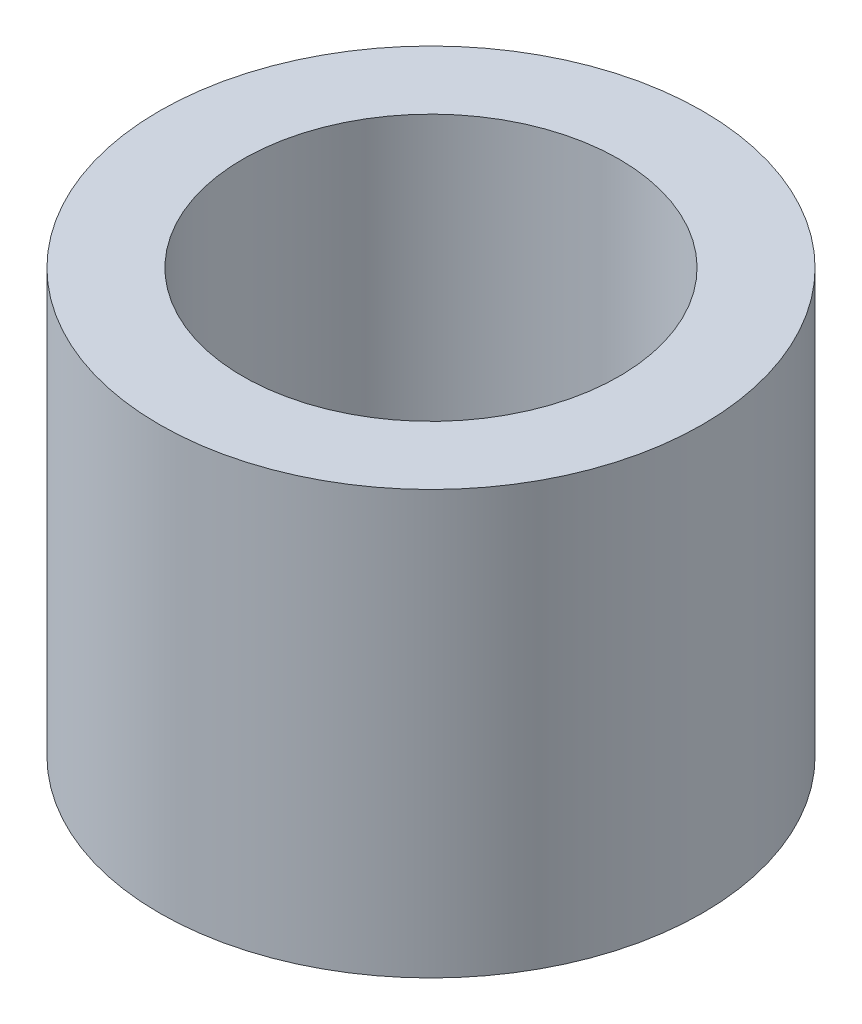
ISO-10303-21;
HEADER;
FILE_DESCRIPTION(('STEP AP214'),'2;1');
FILE_NAME('part.step','',(''),(''),'','','');
FILE_SCHEMA(('AUTOMOTIVE_DESIGN { 1 0 10303 214 1 1 1 1 }'));
ENDSEC;
DATA;
#1=APPLICATION_CONTEXT('core data for automotive mechanical design processes');
#2=APPLICATION_PROTOCOL_DEFINITION('international standard','automotive_design',2000,#1);
#3=PRODUCT_CONTEXT('',#1,'mechanical');
#4=PRODUCT('Part','Part','',(#3));
#5=PRODUCT_RELATED_PRODUCT_CATEGORY('part','',(#4));
#6=PRODUCT_DEFINITION_FORMATION('','',#4);
#7=PRODUCT_DEFINITION_CONTEXT('part definition',#1,'design');
#8=PRODUCT_DEFINITION('design','',#6,#7);
#9=PRODUCT_DEFINITION_SHAPE('','',#8);
#10=(LENGTH_UNIT() NAMED_UNIT(*) SI_UNIT(.MILLI.,.METRE.));
#11=(NAMED_UNIT(*) PLANE_ANGLE_UNIT() SI_UNIT($,.RADIAN.));
#12=(NAMED_UNIT(*) SI_UNIT($,.STERADIAN.) SOLID_ANGLE_UNIT());
#13=UNCERTAINTY_MEASURE_WITH_UNIT(LENGTH_MEASURE(1.E-05),#10,'distance_accuracy_value','');
#14=(GEOMETRIC_REPRESENTATION_CONTEXT(3) GLOBAL_UNCERTAINTY_ASSIGNED_CONTEXT((#13)) GLOBAL_UNIT_ASSIGNED_CONTEXT((#10,
#11,#12)) REPRESENTATION_CONTEXT('',''));
#15=CARTESIAN_POINT('',(0.,0.,0.));
#16=DIRECTION('',(0.,0.,1.));
#17=DIRECTION('',(1.,0.,0.));
#18=AXIS2_PLACEMENT_3D('',#15,#16,#17);
#19=CARTESIAN_POINT('',(0.,12.363800012,0.));
#20=DIRECTION('',(0.,-1.,0.));
#21=DIRECTION('',(0.,0.,-1.));
#22=AXIS2_PLACEMENT_3D('',#19,#20,#21);
#23=CYLINDRICAL_SURFACE('',#22,5.49926131403117);
#24=CARTESIAN_POINT('',(0.,0.,0.));
#25=DIRECTION('',(0.,-1.,0.));
#26=DIRECTION('',(0.,0.,-1.));
#27=AXIS2_PLACEMENT_3D('',#24,#25,#26);
#28=CIRCLE('',#27,5.49926131403117);
#29=CARTESIAN_POINT('',(0.,0.,-5.49926131403117));
#30=VERTEX_POINT('',#29);
#31=EDGE_CURVE('E27',#30,#30,#28,.T.);
#32=ORIENTED_EDGE('',*,*,#31,.T.);
#33=EDGE_LOOP('',(#32));
#34=FACE_BOUND('',#33,.T.);
#35=CARTESIAN_POINT('',(0.,12.363800012,0.));
#36=DIRECTION('',(0.,-1.,0.));
#37=DIRECTION('',(0.,0.,-1.));
#38=AXIS2_PLACEMENT_3D('',#35,#36,#37);
#39=CIRCLE('',#38,5.49926131403117);
#40=CARTESIAN_POINT('',(0.,12.363800012,-5.49926131403117));
#41=VERTEX_POINT('',#40);
#42=EDGE_CURVE('E18',#41,#41,#39,.T.);
#43=ORIENTED_EDGE('',*,*,#42,.F.);
#44=EDGE_LOOP('',(#43));
#45=FACE_BOUND('',#44,.T.);
#46=ADVANCED_FACE('F15',(#34,#45),#23,.F.);
#47=CARTESIAN_POINT('',(0.,12.363800012,0.));
#48=DIRECTION('',(0.,1.,0.));
#49=DIRECTION('',(0.,0.,1.));
#50=AXIS2_PLACEMENT_3D('',#47,#48,#49);
#51=PLANE('',#50);
#52=CARTESIAN_POINT('',(0.,12.363800012,0.));
#53=DIRECTION('',(0.,-1.,0.));
#54=DIRECTION('',(0.,0.,-1.));
#55=AXIS2_PLACEMENT_3D('',#52,#53,#54);
#56=CIRCLE('',#55,7.9375);
#57=CARTESIAN_POINT('',(0.,12.363800012,-7.9375));
#58=VERTEX_POINT('',#57);
#59=EDGE_CURVE('E22',#58,#58,#56,.T.);
#60=ORIENTED_EDGE('',*,*,#59,.F.);
#61=EDGE_LOOP('',(#60));
#62=FACE_BOUND('',#61,.T.);
#63=ORIENTED_EDGE('',*,*,#42,.T.);
#64=EDGE_LOOP('',(#63));
#65=FACE_BOUND('',#64,.T.);
#66=ADVANCED_FACE('F35',(#62,#65),#51,.T.);
#67=CARTESIAN_POINT('',(0.,0.,0.));
#68=DIRECTION('',(0.,1.,0.));
#69=DIRECTION('',(0.,0.,1.));
#70=AXIS2_PLACEMENT_3D('',#67,#68,#69);
#71=PLANE('',#70);
#72=CARTESIAN_POINT('',(0.,0.,0.));
#73=DIRECTION('',(0.,-1.,0.));
#74=DIRECTION('',(0.,0.,-1.));
#75=AXIS2_PLACEMENT_3D('',#72,#73,#74);
#76=CIRCLE('',#75,7.9375);
#77=CARTESIAN_POINT('',(0.,0.,-7.9375));
#78=VERTEX_POINT('',#77);
#79=EDGE_CURVE('E10',#78,#78,#76,.F.);
#80=ORIENTED_EDGE('',*,*,#79,.F.);
#81=EDGE_LOOP('',(#80));
#82=FACE_BOUND('',#81,.T.);
#83=ORIENTED_EDGE('',*,*,#31,.F.);
#84=EDGE_LOOP('',(#83));
#85=FACE_BOUND('',#84,.T.);
#86=ADVANCED_FACE('F42',(#82,#85),#71,.F.);
#87=CARTESIAN_POINT('',(0.,12.363800012,0.));
#88=DIRECTION('',(0.,-1.,0.));
#89=DIRECTION('',(0.,0.,-1.));
#90=AXIS2_PLACEMENT_3D('',#87,#88,#89);
#91=CYLINDRICAL_SURFACE('',#90,7.9375);
#92=ORIENTED_EDGE('',*,*,#79,.T.);
#93=EDGE_LOOP('',(#92));
#94=FACE_BOUND('',#93,.T.);
#95=ORIENTED_EDGE('',*,*,#59,.T.);
#96=EDGE_LOOP('',(#95));
#97=FACE_BOUND('',#96,.T.);
#98=ADVANCED_FACE('F44',(#94,#97),#91,.T.);
#99=CLOSED_SHELL('',(#46,#66,#86,#98));
#100=MANIFOLD_SOLID_BREP('B1',#99);
#101=ADVANCED_BREP_SHAPE_REPRESENTATION('',(#18,#100),#14);
#102=SHAPE_DEFINITION_REPRESENTATION(#9,#101);
ENDSEC;
END-ISO-10303-21;
